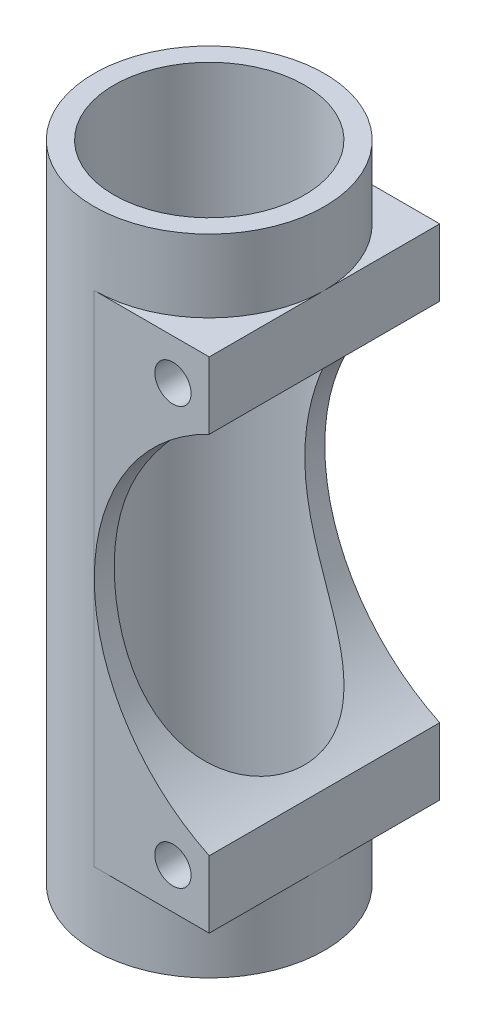
ISO-10303-21;
HEADER;
FILE_DESCRIPTION(('STEP AP214'),'2;1');
FILE_NAME('part.step','',(''),(''),'','','');
FILE_SCHEMA(('AUTOMOTIVE_DESIGN { 1 0 10303 214 1 1 1 1 }'));
ENDSEC;
DATA;
#1=APPLICATION_CONTEXT('core data for automotive mechanical design processes');
#2=APPLICATION_PROTOCOL_DEFINITION('international standard','automotive_design',2000,#1);
#3=PRODUCT_CONTEXT('',#1,'mechanical');
#4=PRODUCT('Part','Part','',(#3));
#5=PRODUCT_RELATED_PRODUCT_CATEGORY('part','',(#4));
#6=PRODUCT_DEFINITION_FORMATION('','',#4);
#7=PRODUCT_DEFINITION_CONTEXT('part definition',#1,'design');
#8=PRODUCT_DEFINITION('design','',#6,#7);
#9=PRODUCT_DEFINITION_SHAPE('','',#8);
#10=(LENGTH_UNIT() NAMED_UNIT(*) SI_UNIT(.MILLI.,.METRE.));
#11=(NAMED_UNIT(*) PLANE_ANGLE_UNIT() SI_UNIT($,.RADIAN.));
#12=(NAMED_UNIT(*) SI_UNIT($,.STERADIAN.) SOLID_ANGLE_UNIT());
#13=UNCERTAINTY_MEASURE_WITH_UNIT(LENGTH_MEASURE(1.E-05),#10,'distance_accuracy_value','');
#14=(GEOMETRIC_REPRESENTATION_CONTEXT(3) GLOBAL_UNCERTAINTY_ASSIGNED_CONTEXT((#13)) GLOBAL_UNIT_ASSIGNED_CONTEXT((#10,
#11,#12)) REPRESENTATION_CONTEXT('',''));
#15=CARTESIAN_POINT('',(0.,0.,0.));
#16=DIRECTION('',(0.,0.,1.));
#17=DIRECTION('',(1.,0.,0.));
#18=AXIS2_PLACEMENT_3D('',#15,#16,#17);
#19=CARTESIAN_POINT('',(12.7,63.,0.));
#20=DIRECTION('',(-1.,0.,0.));
#21=DIRECTION('',(0.,0.,1.));
#22=AXIS2_PLACEMENT_3D('',#19,#20,#21);
#23=PLANE('',#22);
#24=DIRECTION('',(0.,0.,-1.));
#25=VECTOR('',#24,1.);
#26=CARTESIAN_POINT('',(12.7,55.6104230423969,15.));
#27=LINE('',#26,#25);
#28=CARTESIAN_POINT('',(12.7,55.6104230423969,-12.7));
#29=VERTEX_POINT('',#28);
#30=CARTESIAN_POINT('',(12.7,55.6104230423969,12.7));
#31=VERTEX_POINT('',#30);
#32=EDGE_CURVE('E56',#29,#31,#27,.F.);
#33=ORIENTED_EDGE('',*,*,#32,.F.);
#34=DIRECTION('',(0.,-1.,0.));
#35=VECTOR('',#34,1.);
#36=CARTESIAN_POINT('',(12.7,63.,-12.7));
#37=LINE('',#36,#35);
#38=CARTESIAN_POINT('',(12.7,63.,-12.7));
#39=VERTEX_POINT('',#38);
#40=EDGE_CURVE('E212',#39,#29,#37,.T.);
#41=ORIENTED_EDGE('',*,*,#40,.F.);
#42=DIRECTION('',(0.,0.,-1.));
#43=VECTOR('',#42,1.);
#44=CARTESIAN_POINT('',(12.7,63.,0.));
#45=LINE('',#44,#43);
#46=CARTESIAN_POINT('',(12.7,63.,0.));
#47=VERTEX_POINT('',#46);
#48=EDGE_CURVE('E222',#47,#39,#45,.T.);
#49=ORIENTED_EDGE('',*,*,#48,.F.);
#50=DIRECTION('',(0.,0.,-1.));
#51=VECTOR('',#50,1.);
#52=CARTESIAN_POINT('',(12.7,63.,0.));
#53=LINE('',#52,#51);
#54=CARTESIAN_POINT('',(12.7,63.,12.7));
#55=VERTEX_POINT('',#54);
#56=EDGE_CURVE('E224',#55,#47,#53,.T.);
#57=ORIENTED_EDGE('',*,*,#56,.F.);
#58=DIRECTION('',(0.,-1.,0.));
#59=VECTOR('',#58,1.);
#60=CARTESIAN_POINT('',(12.7,63.,12.7));
#61=LINE('',#60,#59);
#62=EDGE_CURVE('E122',#55,#31,#61,.T.);
#63=ORIENTED_EDGE('',*,*,#62,.T.);
#64=EDGE_LOOP('',(#33,#41,#49,#57,#63));
#65=FACE_BOUND('',#64,.T.);
#66=ADVANCED_FACE('F35',(#65),#23,.F.);
#67=DIRECTION('',(0.,0.,-1.));
#68=VECTOR('',#67,1.);
#69=CARTESIAN_POINT('',(12.7,15.3895769576031,15.));
#70=LINE('',#69,#68);
#71=CARTESIAN_POINT('',(12.7,15.3895769576031,12.7));
#72=VERTEX_POINT('',#71);
#73=CARTESIAN_POINT('',(12.7,15.3895769576031,-12.7));
#74=VERTEX_POINT('',#73);
#75=EDGE_CURVE('E101',#72,#74,#70,.T.);
#76=ORIENTED_EDGE('',*,*,#75,.F.);
#77=CARTESIAN_POINT('',(12.7,8.,12.7));
#78=VERTEX_POINT('',#77);
#79=EDGE_CURVE('E112',#72,#78,#61,.T.);
#80=ORIENTED_EDGE('',*,*,#79,.T.);
#81=DIRECTION('',(0.,0.,1.));
#82=VECTOR('',#81,1.);
#83=CARTESIAN_POINT('',(12.7,8.,0.));
#84=LINE('',#83,#82);
#85=CARTESIAN_POINT('',(12.7,8.,0.));
#86=VERTEX_POINT('',#85);
#87=EDGE_CURVE('E209',#86,#78,#84,.T.);
#88=ORIENTED_EDGE('',*,*,#87,.F.);
#89=DIRECTION('',(0.,0.,1.));
#90=VECTOR('',#89,1.);
#91=CARTESIAN_POINT('',(12.7,8.,0.));
#92=LINE('',#91,#90);
#93=CARTESIAN_POINT('',(12.7,8.,-12.7));
#94=VERTEX_POINT('',#93);
#95=EDGE_CURVE('E205',#94,#86,#92,.T.);
#96=ORIENTED_EDGE('',*,*,#95,.F.);
#97=EDGE_CURVE('E115',#74,#94,#37,.T.);
#98=ORIENTED_EDGE('',*,*,#97,.F.);
#99=EDGE_LOOP('',(#76,#80,#88,#96,#98));
#100=FACE_BOUND('',#99,.T.);
#101=ADVANCED_FACE('F110',(#100),#23,.F.);
#102=CARTESIAN_POINT('',(0.,71.,0.));
#103=DIRECTION('',(0.,-1.,0.));
#104=DIRECTION('',(0.,0.,-1.));
#105=AXIS2_PLACEMENT_3D('',#102,#103,#104);
#106=CYLINDRICAL_SURFACE('',#105,10.5);
#107=CARTESIAN_POINT('',(0.,0.,0.));
#108=DIRECTION('',(0.,1.,0.));
#109=DIRECTION('',(0.,0.,1.));
#110=AXIS2_PLACEMENT_3D('',#107,#108,#109);
#111=CIRCLE('',#110,10.5);
#112=CARTESIAN_POINT('',(0.,0.,10.5));
#113=VERTEX_POINT('',#112);
#114=EDGE_CURVE('E134',#113,#113,#111,.T.);
#115=ORIENTED_EDGE('',*,*,#114,.F.);
#116=EDGE_LOOP('',(#115));
#117=FACE_BOUND('',#116,.T.);
#118=CARTESIAN_POINT('',(0.,71.,0.));
#119=DIRECTION('',(0.,1.,0.));
#120=DIRECTION('',(0.,0.,1.));
#121=AXIS2_PLACEMENT_3D('',#118,#119,#120);
#122=CIRCLE('',#121,10.5);
#123=CARTESIAN_POINT('',(0.,71.,10.5));
#124=VERTEX_POINT('',#123);
#125=EDGE_CURVE('E131',#124,#124,#122,.T.);
#126=ORIENTED_EDGE('',*,*,#125,.T.);
#127=EDGE_LOOP('',(#126));
#128=FACE_BOUND('',#127,.T.);
#129=CARTESIAN_POINT('',(0.0334549910854104,35.5,10.4999467028919));
#130=CARTESIAN_POINT('',(0.0334532838015858,35.1873498070494,10.4999412191237));
#131=CARTESIAN_POINT('',(0.0400304847042457,34.8747329443358,10.4999304589833));
#132=CARTESIAN_POINT('',(0.066323780495252,34.2500293337308,10.4998002243213));
#133=CARTESIAN_POINT('',(0.0860400887395591,33.9379425945302,10.4996807480342));
#134=CARTESIAN_POINT('',(0.138580935299864,33.3148555102572,10.499117917577));
#135=CARTESIAN_POINT('',(0.171406470584911,33.0038552496275,10.4986745387716));
#136=CARTESIAN_POINT('',(0.250111352875709,32.3834754081164,10.4970946237287));
#137=CARTESIAN_POINT('',(0.295992176223111,32.0740960145607,10.4959580090809));
#138=CARTESIAN_POINT('',(0.400750665115911,31.457390725088,10.4924804610164));
#139=CARTESIAN_POINT('',(0.459634887612319,31.1500659460453,10.4901389192211));
#140=CARTESIAN_POINT('',(0.590270584807654,30.5382207951896,10.4835993860834));
#141=CARTESIAN_POINT('',(0.662020544175722,30.2337000975469,10.4794016132833));
#142=CARTESIAN_POINT('',(0.818247177100978,29.6280274181659,10.4683621694474));
#143=CARTESIAN_POINT('',(0.90272209932753,29.3268749789733,10.4615208620376));
#144=CARTESIAN_POINT('',(1.08422230535112,28.7285073183845,10.4442690521053));
#145=CARTESIAN_POINT('',(1.181247002069,28.43129191353,10.4338587165046));
#146=CARTESIAN_POINT('',(1.44789816448664,27.6691686645804,10.4010003129192));
#147=CARTESIAN_POINT('',(1.6268495600335,27.2076234545727,10.3750726694734));
#148=CARTESIAN_POINT('',(2.01457710464675,26.2984546032389,10.3068037408248));
#149=CARTESIAN_POINT('',(2.22335330940053,25.8508309879084,10.264462424975));
#150=CARTESIAN_POINT('',(2.66859573831134,24.973224666901,10.1578007857593));
#151=CARTESIAN_POINT('',(2.90501132465722,24.5432115906374,10.0935202546543));
#152=CARTESIAN_POINT('',(3.40317067979025,23.7035162835784,9.93662801997184));
#153=CARTESIAN_POINT('',(3.66490457253901,23.2938262188728,9.84402733315377));
#154=CARTESIAN_POINT('',(4.12894367428616,22.6165849405995,9.6563201650979));
#155=CARTESIAN_POINT('',(4.32588547830423,22.3428793928227,9.5700820319011));
#156=CARTESIAN_POINT('',(4.72834625986039,21.8091104111034,9.37776448571488));
#157=CARTESIAN_POINT('',(4.93386299394671,21.5490434485996,9.27169023745603));
#158=CARTESIAN_POINT('',(5.35081584615413,21.0444515350184,9.03747089111402));
#159=CARTESIAN_POINT('',(5.56224597843707,20.7999116323489,8.9093474801578));
#160=CARTESIAN_POINT('',(5.98809592016627,20.3278807683158,8.62888510082983));
#161=CARTESIAN_POINT('',(6.20251519274744,20.1003867910375,8.47655043108322));
#162=CARTESIAN_POINT('',(6.59303409528827,19.7024373473319,8.17506103111648));
#163=CARTESIAN_POINT('',(6.76926013541841,19.5289751116921,8.03003270414369));
#164=CARTESIAN_POINT('',(7.11876576337152,19.1957252770633,7.72187945457256));
#165=CARTESIAN_POINT('',(7.29204595503237,19.0359348478824,7.55875829349388));
#166=CARTESIAN_POINT('',(7.63305888898937,18.7307942733277,7.21423210780559));
#167=CARTESIAN_POINT('',(7.80079208696623,18.5854429398192,7.03282859005589));
#168=CARTESIAN_POINT('',(8.12798493504064,18.3097791123213,6.65198279285011));
#169=CARTESIAN_POINT('',(8.28744446110267,18.1794668437556,6.45254024308309));
#170=CARTESIAN_POINT('',(8.59616440783506,17.9336346537273,6.03520388738829));
#171=CARTESIAN_POINT('',(8.74536411291063,17.8181997563493,5.81721490909189));
#172=CARTESIAN_POINT('',(9.02988429204928,17.6031836493838,5.36493802056833));
#173=CARTESIAN_POINT('',(9.165204459688,17.5036027897858,5.13064975068645));
#174=CARTESIAN_POINT('',(9.41944495304614,17.3203310187621,4.64742808731445));
#175=CARTESIAN_POINT('',(9.5383663529559,17.2366390664087,4.3984956546058));
#176=CARTESIAN_POINT('',(9.75760498375693,17.0850144126462,3.88796862009996));
#177=CARTESIAN_POINT('',(9.85792387223081,17.0170803069937,3.62637514909041));
#178=CARTESIAN_POINT('',(10.0293573254992,16.9025963632934,3.11875572701642));
#179=CARTESIAN_POINT('',(10.1023631032926,16.8546095103505,2.87368937833849));
#180=CARTESIAN_POINT('',(10.2306492665447,16.7710991335061,2.37689230084512));
#181=CARTESIAN_POINT('',(10.2859308806422,16.7355747456908,2.12516203528239));
#182=CARTESIAN_POINT('',(10.3779604175509,16.676816642188,1.6169759126805));
#183=CARTESIAN_POINT('',(10.4147118563921,16.653580594794,1.36052096171202));
#184=CARTESIAN_POINT('',(10.4691720233172,16.6192554314381,0.844789469693714));
#185=CARTESIAN_POINT('',(10.4868808678369,16.6081662412043,0.585512945906178));
#186=CARTESIAN_POINT('',(10.5027361054589,16.5982354965282,0.0748312841123741));
#187=CARTESIAN_POINT('',(10.501517688845,16.5989962652336,-0.176546715945235));
#188=CARTESIAN_POINT('',(10.4810769692892,16.6118049523751,-0.678275729176621));
#189=CARTESIAN_POINT('',(10.4618552072258,16.6238525317193,-0.928626772976522));
#190=CARTESIAN_POINT('',(10.4056659818481,16.6593014503233,-1.42648669015901));
#191=CARTESIAN_POINT('',(10.3687005874124,16.6827014659112,-1.67399589145163));
#192=CARTESIAN_POINT('',(10.277519002864,16.7409785928792,-2.16444345678371));
#193=CARTESIAN_POINT('',(10.2233027393115,16.7758557531195,-2.40738180135959));
#194=CARTESIAN_POINT('',(10.0985125202604,16.8571442076073,-2.8863715880607));
#195=CARTESIAN_POINT('',(10.0279802652276,16.9035261194492,-3.12243888829953));
#196=CARTESIAN_POINT('',(9.87145030236364,17.0080373734036,-3.58670882848431));
#197=CARTESIAN_POINT('',(9.78545273783286,17.066166606667,-3.81491154127963));
#198=CARTESIAN_POINT('',(9.59919595210787,17.1943166425821,-4.2619316024329));
#199=CARTESIAN_POINT('',(9.49893819311239,17.2643362261746,-4.48074991005007));
#200=CARTESIAN_POINT('',(9.28556014640257,17.4163708726711,-4.90768031724999));
#201=CARTESIAN_POINT('',(9.17243971349795,17.4983860709813,-5.11579229594417));
#202=CARTESIAN_POINT('',(8.93290462919394,17.6759295038578,-5.52359312418266));
#203=CARTESIAN_POINT('',(8.80629664852225,17.7716637796272,-5.72307860440436));
#204=CARTESIAN_POINT('',(8.54324307156812,17.9754701890568,-6.10880507916691));
#205=CARTESIAN_POINT('',(8.40679744035674,18.083542366524,-6.29504602667791));
#206=CARTESIAN_POINT('',(8.12598003775397,18.3118152269952,-6.65359362618394));
#207=CARTESIAN_POINT('',(7.98160795690152,18.4320163836873,-6.82589973349049));
#208=CARTESIAN_POINT('',(7.6868787421882,18.6842120978674,-7.15617895913933));
#209=CARTESIAN_POINT('',(7.53652094134761,18.8162079716738,-7.31415047373186));
#210=CARTESIAN_POINT('',(7.22118172431152,19.1010729476438,-7.62607819629806));
#211=CARTESIAN_POINT('',(7.05590905314001,19.2547546845719,-7.77899719629309));
#212=CARTESIAN_POINT('',(6.72296015188509,19.5743796575865,-8.06848725503758));
#213=CARTESIAN_POINT('',(6.55528386669617,19.7403231751516,-8.20505793831037));
#214=CARTESIAN_POINT('',(6.21953025828227,20.0837408035154,-8.4623990986153));
#215=CARTESIAN_POINT('',(6.05145284179263,20.2612179130789,-8.58316544167994));
#216=CARTESIAN_POINT('',(5.71674562965881,20.6268463486376,-8.80963492938912));
#217=CARTESIAN_POINT('',(5.55011612998119,20.8149998004121,-8.91533505936354));
#218=CARTESIAN_POINT('',(5.13514471326988,21.3002625495795,-9.16324202969921));
#219=CARTESIAN_POINT('',(4.88875495084101,21.6037322257429,-9.29634457671393));
#220=CARTESIAN_POINT('',(4.40743308870188,22.2303269931879,-9.53397374411841));
#221=CARTESIAN_POINT('',(4.17250582710901,22.5534602569977,-9.63848838233754));
#222=CARTESIAN_POINT('',(3.71696615088132,23.2174073801943,-9.8231721903499));
#223=CARTESIAN_POINT('',(3.49638731936657,23.5582595806767,-9.90328575448152));
#224=CARTESIAN_POINT('',(3.07255543273648,24.254547130045,-10.0428665341322));
#225=CARTESIAN_POINT('',(2.8693025621472,24.6099826341873,-10.1023335297806));
#226=CARTESIAN_POINT('',(2.40784616626902,25.4715121882989,-10.2239458124626));
#227=CARTESIAN_POINT('',(2.15827851603747,25.9833303161181,-10.2784503739582));
#228=CARTESIAN_POINT('',(1.69845686253893,27.0262477040247,-10.3643593250636));
#229=CARTESIAN_POINT('',(1.48821753887911,27.5573540756244,-10.395755101919));
#230=CARTESIAN_POINT('',(1.10889929160603,28.6348925345374,-10.4430304723919));
#231=CARTESIAN_POINT('',(0.939833965820634,29.1813296185989,-10.4589049452593));
#232=CARTESIAN_POINT('',(0.644178264358825,30.2856671198503,-10.4812694871218));
#233=CARTESIAN_POINT('',(0.517583496879344,30.8435663454254,-10.4877605266705));
#234=CARTESIAN_POINT('',(0.305415365628885,31.9793469398847,-10.4961065807705));
#235=CARTESIAN_POINT('',(0.220764987267538,32.5574014670036,-10.49786077174));
#236=CARTESIAN_POINT('',(0.0970804005859797,33.7183849337183,-10.4997337171234));
#237=CARTESIAN_POINT('',(0.0580471987405413,34.3013139805774,-10.4998524354536));
#238=CARTESIAN_POINT('',(0.0258318900700132,35.4685630472047,-10.4999800470454));
#239=CARTESIAN_POINT('',(0.03266090838906,36.0528833700996,-10.4999889136581));
#240=CARTESIAN_POINT('',(0.0921695408085583,37.2192578345058,-10.4996400679739));
#241=CARTESIAN_POINT('',(0.144849815895211,37.8013119432262,-10.4992823503924));
#242=CARTESIAN_POINT('',(0.260785894182434,38.6913535663228,-10.4968335445191));
#243=CARTESIAN_POINT('',(0.307869314625543,39.0015358667828,-10.4956210953568));
#244=CARTESIAN_POINT('',(0.415076593269348,39.6196236594331,-10.4919311489897));
#245=CARTESIAN_POINT('',(0.475199346119684,39.9275293423268,-10.4894537589905));
#246=CARTESIAN_POINT('',(0.608396652160263,40.5406026228009,-10.4825709336796));
#247=CARTESIAN_POINT('',(0.681475274032285,40.8457693285063,-10.4781648920506));
#248=CARTESIAN_POINT('',(0.840422423215824,41.4526695519797,-10.4666155412439));
#249=CARTESIAN_POINT('',(0.926289558289999,41.7544034396217,-10.4594725298967));
#250=CARTESIAN_POINT('',(1.11059686373569,42.3537324911854,-10.4415105500119));
#251=CARTESIAN_POINT('',(1.20903066055416,42.6513296689011,-10.4306934403154));
#252=CARTESIAN_POINT('',(1.41827079891917,43.2418935443719,-10.4043080485618));
#253=CARTESIAN_POINT('',(1.52907566345185,43.534860790149,-10.388740333308));
#254=CARTESIAN_POINT('',(1.76274698199949,44.1154516530069,-10.3516527119485));
#255=CARTESIAN_POINT('',(1.88560913193557,44.4030771336447,-10.3301349248851));
#256=CARTESIAN_POINT('',(2.14304585001128,44.9723495419089,-10.279812649974));
#257=CARTESIAN_POINT('',(2.27761916180308,45.2539971068107,-10.2510089431132));
#258=CARTESIAN_POINT('',(2.60214808342186,45.8981539980666,-10.1742191483676));
#259=CARTESIAN_POINT('',(2.79621091656389,46.2582370783645,-10.1230491897023));
#260=CARTESIAN_POINT('',(3.20231891390129,46.9647822631699,-10.002000869936));
#261=CARTESIAN_POINT('',(3.41435921384547,47.3112480152862,-9.93212755852473));
#262=CARTESIAN_POINT('',(3.85405402744822,47.9878700552137,-9.76990708558562));
#263=CARTESIAN_POINT('',(4.08168128772718,48.3180531571242,-9.67759846558533));
#264=CARTESIAN_POINT('',(4.55001295946686,48.9601804538429,-9.46643074685749));
#265=CARTESIAN_POINT('',(4.79071411357663,49.2721291518903,-9.34757823876452));
#266=CARTESIAN_POINT('',(5.22521048175192,49.8060975192893,-9.11008541815966));
#267=CARTESIAN_POINT('',(5.41715113814696,50.0323742432752,-8.99760647659784));
#268=CARTESIAN_POINT('',(5.80420872654657,50.4710836734365,-8.752916975293));
#269=CARTESIAN_POINT('',(5.99932482306528,50.6835199498447,-8.62071153331192));
#270=CARTESIAN_POINT('',(6.39006348581048,51.0932546478665,-8.33520358009782));
#271=CARTESIAN_POINT('',(6.58568603258333,51.2905536422668,-8.18190186775007));
#272=CARTESIAN_POINT('',(6.97431809498648,51.6687650776879,-7.85325600699461));
#273=CARTESIAN_POINT('',(7.16732758365465,51.8496773497363,-7.67791163133748));
#274=CARTESIAN_POINT('',(7.54901375473165,52.1956037509768,-7.30305306857659));
#275=CARTESIAN_POINT('',(7.73763350978376,52.3604545289892,-7.10332942913143));
#276=CARTESIAN_POINT('',(8.10485020182736,52.6714334232292,-6.68128916736555));
#277=CARTESIAN_POINT('',(8.28344684630497,52.8175609931992,-6.45897188620491));
#278=CARTESIAN_POINT('',(8.62665786670672,53.0904184308616,-5.99286968933409));
#279=CARTESIAN_POINT('',(8.79127926899439,53.2171580722808,-5.74909568855167));
#280=CARTESIAN_POINT('',(9.10291509731808,53.4510356179364,-5.24170992336792));
#281=CARTESIAN_POINT('',(9.24993256233341,53.5581769071391,-4.97810159581106));
#282=CARTESIAN_POINT('',(9.50275282657521,53.7384363565774,-4.4738195886984));
#283=CARTESIAN_POINT('',(9.6114344762756,53.8142437489694,-4.23554094922914));
#284=CARTESIAN_POINT('',(9.81180923569083,53.9517975171639,-3.74804243862736));
#285=CARTESIAN_POINT('',(9.90350414771204,54.0135453848527,-3.49882373171939));
#286=CARTESIAN_POINT('',(10.0683877280121,54.1231693693235,-2.99144089335724));
#287=CARTESIAN_POINT('',(10.1415804858482,54.1710485518624,-2.73327875305197));
#288=CARTESIAN_POINT('',(10.2683066516484,54.253173190285,-2.21005079647143));
#289=CARTESIAN_POINT('',(10.3218406048271,54.2874190242764,-1.94498517187479));
#290=CARTESIAN_POINT('',(10.4053935713746,54.3405571242782,-1.42875387276544));
#291=CARTESIAN_POINT('',(10.4367880380228,54.360350880808,-1.17790212438372));
#292=CARTESIAN_POINT('',(10.481400674247,54.3884127950895,-0.673956671214395));
#293=CARTESIAN_POINT('',(10.4946199025923,54.3966816242076,-0.420863097885181));
#294=CARTESIAN_POINT('',(10.502705080375,54.4017435992588,0.0856861884853747));
#295=CARTESIAN_POINT('',(10.4975742107734,54.3985387341389,0.33914183114876));
#296=CARTESIAN_POINT('',(10.4690353362903,54.3806386156061,0.844616632794512));
#297=CARTESIAN_POINT('',(10.445627225804,54.3659432958022,1.09663578346845));
#298=CARTESIAN_POINT('',(10.3812320753894,54.3252192366925,1.59444958328446));
#299=CARTESIAN_POINT('',(10.3404554151143,54.2993260775285,1.8402825855742));
#300=CARTESIAN_POINT('',(10.2419062436946,54.2361038300817,2.32701732516662));
#301=CARTESIAN_POINT('',(10.1841339986159,54.1987749208251,2.56791913960391));
#302=CARTESIAN_POINT('',(10.0523805368073,54.112522037863,3.04309498069955));
#303=CARTESIAN_POINT('',(9.97840092571574,54.0635992127092,3.27736966130353));
#304=CARTESIAN_POINT('',(9.81524428362003,53.9539887408036,3.73772900706519));
#305=CARTESIAN_POINT('',(9.72606716024842,53.8933010225467,3.96381362243514));
#306=CARTESIAN_POINT('',(9.53313147469995,53.759586575173,4.40776152099044));
#307=CARTESIAN_POINT('',(9.42928209204445,53.686482371019,4.62556197231269));
#308=CARTESIAN_POINT('',(9.20892030936684,53.5281276305411,5.050047116738));
#309=CARTESIAN_POINT('',(9.09240796514956,53.4428771477445,5.25673185882126));
#310=CARTESIAN_POINT('',(8.8483782959983,53.2602351940507,5.65785417692575));
#311=CARTESIAN_POINT('',(8.72086141056764,53.1628442079563,5.85229224152316));
#312=CARTESIAN_POINT('',(8.45660456879553,52.9560297807266,6.22804974570892));
#313=CARTESIAN_POINT('',(8.31986435612697,52.8466060051325,6.40936882041461));
#314=CARTESIAN_POINT('',(8.03340131161858,52.6113381152793,6.76525764040576));
#315=CARTESIAN_POINT('',(7.88337787234407,52.4850119383416,6.93926639403849));
#316=CARTESIAN_POINT('',(7.57749669864499,52.2200010923056,7.27204450616733));
#317=CARTESIAN_POINT('',(7.42163895205111,52.081316397429,7.43081383287426));
#318=CARTESIAN_POINT('',(7.10612017149375,51.7920840171982,7.73309776181561));
#319=CARTESIAN_POINT('',(6.94645836405998,51.6415339046659,7.87660922874046));
#320=CARTESIAN_POINT('',(6.62529438728928,51.3292142123563,8.14860612925635));
#321=CARTESIAN_POINT('',(6.46379185718523,51.1674424004787,8.277088559701));
#322=CARTESIAN_POINT('',(6.07694631361831,50.7673971410088,8.56738334583404));
#323=CARTESIAN_POINT('',(5.85157478912549,50.5241379861677,8.72232519502401));
#324=CARTESIAN_POINT('',(5.4049850818639,50.0191698516533,9.00589693684279));
#325=CARTESIAN_POINT('',(5.18376826103788,49.7574549512547,9.13451833358776));
#326=CARTESIAN_POINT('',(4.74857675646227,49.2171860196302,9.36814424960949));
#327=CARTESIAN_POINT('',(4.53461533209836,48.9386035039244,9.47310732121479));
#328=CARTESIAN_POINT('',(4.11704450841503,48.3669835623188,9.66190723337538));
#329=CARTESIAN_POINT('',(3.91343551135529,48.0739455755995,9.74574325350623));
#330=CARTESIAN_POINT('',(3.44031803886565,47.3564114686263,9.92477698169755));
#331=CARTESIAN_POINT('',(3.1766867634444,46.9258576789547,10.0113015600645));
#332=CARTESIAN_POINT('',(2.6775382413884,46.0441902466389,10.1561982773547));
#333=CARTESIAN_POINT('',(2.4420322689284,45.5930684586613,10.2145591550264));
#334=CARTESIAN_POINT('',(2.00146727933326,44.6734197168069,10.3099459993598));
#335=CARTESIAN_POINT('',(1.79644482367022,44.2048726916729,10.3469464975366));
#336=CARTESIAN_POINT('',(1.41885916520122,43.2540401215193,10.4054466238734));
#337=CARTESIAN_POINT('',(1.2462941419079,42.7717553487769,10.4269471215961));
#338=CARTESIAN_POINT('',(0.915788820618061,41.7369282636586,10.4614653090325));
#339=CARTESIAN_POINT('',(0.76216317192268,41.1829612261821,10.4731372940333));
#340=CARTESIAN_POINT('',(0.498127326915477,40.064700140606,10.4890111614182));
#341=CARTESIAN_POINT('',(0.38772092766968,39.5004051896952,10.4932123875668));
#342=CARTESIAN_POINT('',(0.210840531916164,38.3651492305948,10.4982555025507));
#343=CARTESIAN_POINT('',(0.144353256607916,37.7941902904205,10.4990984071514));
#344=CARTESIAN_POINT('',(0.0556620163256843,36.6487834128098,10.4999490448542));
#345=CARTESIAN_POINT('',(0.0334581273497686,36.0743354693874,10.4999567765228));
#346=CARTESIAN_POINT('',(0.0334549910854104,35.5,10.4999467028919));
#347=B_SPLINE_CURVE_WITH_KNOTS('',3,(#129,#130,#131,#132,#133,#134,#135,#136,#137,#138,#139,
#140,#141,#142,#143,#144,#145,#146,#147,#148,#149,#150,#151,#152,#153,#154,#155,#156,#157,#158,
#159,#160,#161,#162,#163,#164,#165,#166,#167,#168,#169,#170,#171,#172,#173,#174,#175,#176,#177,
#178,#179,#180,#181,#182,#183,#184,#185,#186,#187,#188,#189,#190,#191,#192,#193,#194,#195,#196,
#197,#198,#199,#200,#201,#202,#203,#204,#205,#206,#207,#208,#209,#210,#211,#212,#213,#214,#215,
#216,#217,#218,#219,#220,#221,#222,#223,#224,#225,#226,#227,#228,#229,#230,#231,#232,#233,#234,
#235,#236,#237,#238,#239,#240,#241,#242,#243,#244,#245,#246,#247,#248,#249,#250,#251,#252,#253,
#254,#255,#256,#257,#258,#259,#260,#261,#262,#263,#264,#265,#266,#267,#268,#269,#270,#271,#272,
#273,#274,#275,#276,#277,#278,#279,#280,#281,#282,#283,#284,#285,#286,#287,#288,#289,#290,#291,
#292,#293,#294,#295,#296,#297,#298,#299,#300,#301,#302,#303,#304,#305,#306,#307,#308,#309,#310,
#311,#312,#313,#314,#315,#316,#317,#318,#319,#320,#321,#322,#323,#324,#325,#326,#327,#328,#329,
#330,#331,#332,#333,#334,#335,#336,#337,#338,#339,#340,#341,#342,#343,#344,#345,#346),
.UNSPECIFIED.,.T.,.F.,(4,2,2,2,2,2,2,2,2,2,2,2,2,2,2,2,2,2,2,2,2,2,2,2,2,2,2,2,2,2,2,2,2,2,2,2,
2,2,2,2,2,2,2,2,2,2,2,2,2,2,2,2,2,2,2,2,2,2,2,2,2,2,2,2,2,2,2,2,2,2,2,2,2,2,2,2,2,2,2,2,2,2,2,2,
2,2,2,2,2,2,2,2,2,2,2,2,2,2,2,2,2,2,2,2,2,2,2,2,4),(0.,0.937823724375461,1.87566267772746,
2.81357296820059,3.75158936331786,4.69007983672076,5.62845984691447,6.56671082610852,
7.50491792973154,8.9906608981375,10.4764066406844,11.9594718068817,13.4419607815218,
14.4852883938243,15.5283447321261,16.5703809436553,17.6122323515159,18.4713935240678,
19.3303764097133,20.1892885544814,21.048213571993,21.911848076965,22.775501644655,
23.6390986123936,24.5026185920383,25.2821733081625,26.0616739738836,26.8410266766228,
27.6203746139876,28.3736261893417,29.1268551353203,29.879996277362,30.6331406256961,
31.3843809464987,32.1356143067214,32.8867706931237,33.6379355592118,34.4018717675003,
35.1658106883051,35.9297794557256,36.6938335906208,37.5108452461826,38.3278756626956,
39.1451193658609,39.9625263663278,41.1994362427367,42.4368637587482,43.677090407989,
44.9173302643222,46.6309404070952,48.3451888976117,50.0600027580979,51.7746392381091,
53.5254942101555,55.2763878114689,57.027706155568,58.7790497468798,59.7200260577033,
60.6609226326776,61.6021152134179,62.5432054048583,63.4838201768607,64.4243227662757,
65.3644908381173,66.3045581748249,67.5402712118924,68.7756509566068,70.0089232643643,
71.2418897002556,72.1930253119799,73.1439145926712,74.0947678744646,75.0456309599101,
76.0053297338128,76.9650565009618,77.9242978506122,78.8833733663251,79.7002398667672,
80.5170196473227,81.3336187357279,82.1501951749799,82.9100323866659,83.6698253333911,
84.4294865775757,85.1891522110643,85.9398668230962,86.6905696833143,87.4411982061833,
88.1918312913877,88.9473328031437,89.7028309855902,90.4582990086309,91.2137880356749,
91.9995288847257,92.7852713727818,93.5711750108148,94.3572354231261,95.4536669268025,
96.5504517873252,97.6491434533112,98.7478777780962,100.282220186371,101.817175593941,
103.35395740515,104.890652994915,106.613793332199,108.337085023568,110.059855444674,
111.782628822354),.UNSPECIFIED.);
#348=CARTESIAN_POINT('',(0.0334549910854104,35.5,10.4999467028919));
#349=VERTEX_POINT('',#348);
#350=EDGE_CURVE('E39',#349,#349,#347,.T.);
#351=ORIENTED_EDGE('',*,*,#350,.T.);
#352=EDGE_LOOP('',(#351));
#353=FACE_BOUND('',#352,.T.);
#354=ADVANCED_FACE('F144',(#117,#128,#353),#106,.F.);
#355=CARTESIAN_POINT('',(0.,0.,0.));
#356=DIRECTION('',(0.,1.,0.));
#357=DIRECTION('',(0.,0.,1.));
#358=AXIS2_PLACEMENT_3D('',#355,#356,#357);
#359=PLANE('',#358);
#360=ORIENTED_EDGE('',*,*,#114,.T.);
#361=EDGE_LOOP('',(#360));
#362=FACE_BOUND('',#361,.T.);
#363=CARTESIAN_POINT('',(0.,0.,0.));
#364=DIRECTION('',(0.,1.,0.));
#365=DIRECTION('',(0.,0.,1.));
#366=AXIS2_PLACEMENT_3D('',#363,#364,#365);
#367=CIRCLE('',#366,12.7);
#368=CARTESIAN_POINT('',(0.,0.,12.7));
#369=VERTEX_POINT('',#368);
#370=EDGE_CURVE('E48',#369,#369,#367,.T.);
#371=ORIENTED_EDGE('',*,*,#370,.F.);
#372=EDGE_LOOP('',(#371));
#373=FACE_BOUND('',#372,.T.);
#374=ADVANCED_FACE('F141',(#362,#373),#359,.F.);
#375=CARTESIAN_POINT('',(0.,63.,-12.7));
#376=DIRECTION('',(0.,0.,1.));
#377=DIRECTION('',(1.,0.,0.));
#378=AXIS2_PLACEMENT_3D('',#375,#376,#377);
#379=PLANE('',#378);
#380=CARTESIAN_POINT('',(8.7,58.5,-12.7));
#381=DIRECTION('',(0.,0.,-1.));
#382=DIRECTION('',(-1.,0.,0.));
#383=AXIS2_PLACEMENT_3D('',#380,#381,#382);
#384=CIRCLE('',#383,2.);
#385=CARTESIAN_POINT('',(6.7,58.5,-12.7));
#386=VERTEX_POINT('',#385);
#387=EDGE_CURVE('E182',#386,#386,#384,.T.);
#388=ORIENTED_EDGE('',*,*,#387,.F.);
#389=EDGE_LOOP('',(#388));
#390=FACE_BOUND('',#389,.T.);
#391=CARTESIAN_POINT('',(8.7,12.5,-12.7));
#392=DIRECTION('',(0.,0.,-1.));
#393=DIRECTION('',(-1.,0.,0.));
#394=AXIS2_PLACEMENT_3D('',#391,#392,#393);
#395=CIRCLE('',#394,2.);
#396=CARTESIAN_POINT('',(6.7,12.5,-12.7));
#397=VERTEX_POINT('',#396);
#398=EDGE_CURVE('E195',#397,#397,#395,.T.);
#399=ORIENTED_EDGE('',*,*,#398,.F.);
#400=EDGE_LOOP('',(#399));
#401=FACE_BOUND('',#400,.T.);
#402=CARTESIAN_POINT('',(22.3311879960002,35.5,-12.7));
#403=DIRECTION('',(0.,0.,1.));
#404=DIRECTION('',(1.,0.,0.));
#405=AXIS2_PLACEMENT_3D('',#402,#403,#404);
#406=CIRCLE('',#405,22.2977330049148);
#407=EDGE_CURVE('E200',#74,#29,#406,.F.);
#408=ORIENTED_EDGE('',*,*,#407,.F.);
#409=ORIENTED_EDGE('',*,*,#97,.T.);
#410=DIRECTION('',(1.,0.,0.));
#411=VECTOR('',#410,1.);
#412=CARTESIAN_POINT('',(0.,8.,-12.7));
#413=LINE('',#412,#411);
#414=CARTESIAN_POINT('',(0.,8.,-12.7));
#415=VERTEX_POINT('',#414);
#416=EDGE_CURVE('E203',#415,#94,#413,.T.);
#417=ORIENTED_EDGE('',*,*,#416,.F.);
#418=DIRECTION('',(0.,-1.,0.));
#419=VECTOR('',#418,1.);
#420=CARTESIAN_POINT('',(0.,63.,-12.7));
#421=LINE('',#420,#419);
#422=CARTESIAN_POINT('',(0.,63.,-12.7));
#423=VERTEX_POINT('',#422);
#424=EDGE_CURVE('E215',#423,#415,#421,.T.);
#425=ORIENTED_EDGE('',*,*,#424,.F.);
#426=DIRECTION('',(-1.,0.,0.));
#427=VECTOR('',#426,1.);
#428=CARTESIAN_POINT('',(0.,63.,-12.7));
#429=LINE('',#428,#427);
#430=EDGE_CURVE('E218',#39,#423,#429,.T.);
#431=ORIENTED_EDGE('',*,*,#430,.F.);
#432=ORIENTED_EDGE('',*,*,#40,.T.);
#433=EDGE_LOOP('',(#408,#409,#417,#425,#431,#432));
#434=FACE_BOUND('',#433,.T.);
#435=ADVANCED_FACE('F143',(#390,#401,#434),#379,.F.);
#436=CARTESIAN_POINT('',(0.,63.,12.7));
#437=DIRECTION('',(0.,0.,-1.));
#438=DIRECTION('',(-1.,0.,0.));
#439=AXIS2_PLACEMENT_3D('',#436,#437,#438);
#440=PLANE('',#439);
#441=CARTESIAN_POINT('',(8.70000000000001,58.5,12.7));
#442=DIRECTION('',(0.,0.,1.));
#443=DIRECTION('',(1.,0.,0.));
#444=AXIS2_PLACEMENT_3D('',#441,#442,#443);
#445=CIRCLE('',#444,2.);
#446=CARTESIAN_POINT('',(10.7,58.5,12.7));
#447=VERTEX_POINT('',#446);
#448=EDGE_CURVE('E395',#447,#447,#445,.T.);
#449=ORIENTED_EDGE('',*,*,#448,.F.);
#450=EDGE_LOOP('',(#449));
#451=FACE_BOUND('',#450,.T.);
#452=CARTESIAN_POINT('',(8.70000000000001,12.5,12.7));
#453=DIRECTION('',(0.,0.,1.));
#454=DIRECTION('',(1.,0.,0.));
#455=AXIS2_PLACEMENT_3D('',#452,#453,#454);
#456=CIRCLE('',#455,2.);
#457=CARTESIAN_POINT('',(10.7,12.5,12.7));
#458=VERTEX_POINT('',#457);
#459=EDGE_CURVE('E190',#458,#458,#456,.T.);
#460=ORIENTED_EDGE('',*,*,#459,.F.);
#461=EDGE_LOOP('',(#460));
#462=FACE_BOUND('',#461,.T.);
#463=CARTESIAN_POINT('',(22.3311879960002,35.5,12.7));
#464=DIRECTION('',(0.,0.,-1.));
#465=DIRECTION('',(-1.,0.,0.));
#466=AXIS2_PLACEMENT_3D('',#463,#464,#465);
#467=CIRCLE('',#466,22.2977330049148);
#468=EDGE_CURVE('E98',#31,#72,#467,.F.);
#469=ORIENTED_EDGE('',*,*,#468,.F.);
#470=ORIENTED_EDGE('',*,*,#62,.F.);
#471=DIRECTION('',(1.,0.,0.));
#472=VECTOR('',#471,1.);
#473=CARTESIAN_POINT('',(0.,63.,12.7));
#474=LINE('',#473,#472);
#475=CARTESIAN_POINT('',(0.,63.,12.7));
#476=VERTEX_POINT('',#475);
#477=EDGE_CURVE('E127',#476,#55,#474,.T.);
#478=ORIENTED_EDGE('',*,*,#477,.F.);
#479=DIRECTION('',(0.,-1.,0.));
#480=VECTOR('',#479,1.);
#481=CARTESIAN_POINT('',(0.,63.,12.7));
#482=LINE('',#481,#480);
#483=CARTESIAN_POINT('',(0.,8.,12.7));
#484=VERTEX_POINT('',#483);
#485=EDGE_CURVE('E125',#476,#484,#482,.T.);
#486=ORIENTED_EDGE('',*,*,#485,.T.);
#487=DIRECTION('',(-1.,0.,0.));
#488=VECTOR('',#487,1.);
#489=CARTESIAN_POINT('',(0.,8.,12.7));
#490=LINE('',#489,#488);
#491=EDGE_CURVE('E121',#78,#484,#490,.T.);
#492=ORIENTED_EDGE('',*,*,#491,.F.);
#493=ORIENTED_EDGE('',*,*,#79,.F.);
#494=EDGE_LOOP('',(#469,#470,#478,#486,#492,#493));
#495=FACE_BOUND('',#494,.T.);
#496=ADVANCED_FACE('F118',(#451,#462,#495),#440,.F.);
#497=CARTESIAN_POINT('',(0.,71.,0.));
#498=DIRECTION('',(0.,1.,0.));
#499=DIRECTION('',(0.,0.,1.));
#500=AXIS2_PLACEMENT_3D('',#497,#498,#499);
#501=PLANE('',#500);
#502=CARTESIAN_POINT('',(0.,71.,0.));
#503=DIRECTION('',(0.,1.,0.));
#504=DIRECTION('',(0.,0.,1.));
#505=AXIS2_PLACEMENT_3D('',#502,#503,#504);
#506=CIRCLE('',#505,12.7);
#507=CARTESIAN_POINT('',(0.,71.,12.7));
#508=VERTEX_POINT('',#507);
#509=EDGE_CURVE('E11',#508,#508,#506,.T.);
#510=ORIENTED_EDGE('',*,*,#509,.T.);
#511=EDGE_LOOP('',(#510));
#512=FACE_BOUND('',#511,.T.);
#513=ORIENTED_EDGE('',*,*,#125,.F.);
#514=EDGE_LOOP('',(#513));
#515=FACE_BOUND('',#514,.T.);
#516=ADVANCED_FACE('F163',(#512,#515),#501,.T.);
#517=CARTESIAN_POINT('',(0.,71.,0.));
#518=DIRECTION('',(0.,-1.,0.));
#519=DIRECTION('',(0.,0.,-1.));
#520=AXIS2_PLACEMENT_3D('',#517,#518,#519);
#521=CYLINDRICAL_SURFACE('',#520,12.7);
#522=ORIENTED_EDGE('',*,*,#370,.T.);
#523=EDGE_LOOP('',(#522));
#524=FACE_BOUND('',#523,.T.);
#525=CARTESIAN_POINT('',(0.,63.,0.));
#526=DIRECTION('',(0.,-1.,0.));
#527=DIRECTION('',(0.,0.,-1.));
#528=AXIS2_PLACEMENT_3D('',#525,#526,#527);
#529=CIRCLE('',#528,12.7);
#530=EDGE_CURVE('E219',#423,#47,#529,.T.);
#531=ORIENTED_EDGE('',*,*,#530,.F.);
#532=ORIENTED_EDGE('',*,*,#424,.T.);
#533=CARTESIAN_POINT('',(0.,8.,0.));
#534=DIRECTION('',(0.,-1.,0.));
#535=DIRECTION('',(0.,0.,-1.));
#536=AXIS2_PLACEMENT_3D('',#533,#534,#535);
#537=CIRCLE('',#536,12.7);
#538=EDGE_CURVE('E64',#415,#86,#537,.T.);
#539=ORIENTED_EDGE('',*,*,#538,.T.);
#540=CARTESIAN_POINT('',(0.,8.,0.));
#541=DIRECTION('',(0.,-1.,0.));
#542=DIRECTION('',(0.,0.,-1.));
#543=AXIS2_PLACEMENT_3D('',#540,#541,#542);
#544=CIRCLE('',#543,12.7);
#545=EDGE_CURVE('E207',#86,#484,#544,.T.);
#546=ORIENTED_EDGE('',*,*,#545,.T.);
#547=ORIENTED_EDGE('',*,*,#485,.F.);
#548=CARTESIAN_POINT('',(0.,63.,0.));
#549=DIRECTION('',(0.,-1.,0.));
#550=DIRECTION('',(0.,0.,-1.));
#551=AXIS2_PLACEMENT_3D('',#548,#549,#550);
#552=CIRCLE('',#551,12.7);
#553=EDGE_CURVE('E123',#47,#476,#552,.T.);
#554=ORIENTED_EDGE('',*,*,#553,.F.);
#555=EDGE_LOOP('',(#531,#532,#539,#546,#547,#554));
#556=FACE_BOUND('',#555,.T.);
#557=ORIENTED_EDGE('',*,*,#509,.F.);
#558=EDGE_LOOP('',(#557));
#559=FACE_BOUND('',#558,.T.);
#560=ADVANCED_FACE('F37',(#524,#556,#559),#521,.T.);
#561=CARTESIAN_POINT('',(0.,63.,0.));
#562=DIRECTION('',(0.,-1.,0.));
#563=DIRECTION('',(0.,0.,-1.));
#564=AXIS2_PLACEMENT_3D('',#561,#562,#563);
#565=PLANE('',#564);
#566=ORIENTED_EDGE('',*,*,#56,.T.);
#567=ORIENTED_EDGE('',*,*,#553,.T.);
#568=ORIENTED_EDGE('',*,*,#477,.T.);
#569=EDGE_LOOP('',(#566,#567,#568));
#570=FACE_BOUND('',#569,.T.);
#571=ADVANCED_FACE('F170',(#570),#565,.F.);
#572=CARTESIAN_POINT('',(0.,63.,0.));
#573=DIRECTION('',(0.,-1.,0.));
#574=DIRECTION('',(0.,0.,-1.));
#575=AXIS2_PLACEMENT_3D('',#572,#573,#574);
#576=PLANE('',#575);
#577=ORIENTED_EDGE('',*,*,#430,.T.);
#578=ORIENTED_EDGE('',*,*,#530,.T.);
#579=ORIENTED_EDGE('',*,*,#48,.T.);
#580=EDGE_LOOP('',(#577,#578,#579));
#581=FACE_BOUND('',#580,.T.);
#582=ADVANCED_FACE('F236',(#581),#576,.F.);
#583=CARTESIAN_POINT('',(0.,8.,0.));
#584=DIRECTION('',(0.,-1.,0.));
#585=DIRECTION('',(0.,0.,-1.));
#586=AXIS2_PLACEMENT_3D('',#583,#584,#585);
#587=PLANE('',#586);
#588=ORIENTED_EDGE('',*,*,#545,.F.);
#589=ORIENTED_EDGE('',*,*,#87,.T.);
#590=ORIENTED_EDGE('',*,*,#491,.T.);
#591=EDGE_LOOP('',(#588,#589,#590));
#592=FACE_BOUND('',#591,.T.);
#593=ADVANCED_FACE('F241',(#592),#587,.T.);
#594=CARTESIAN_POINT('',(0.,8.,0.));
#595=DIRECTION('',(0.,-1.,0.));
#596=DIRECTION('',(0.,0.,-1.));
#597=AXIS2_PLACEMENT_3D('',#594,#595,#596);
#598=PLANE('',#597);
#599=ORIENTED_EDGE('',*,*,#538,.F.);
#600=ORIENTED_EDGE('',*,*,#416,.T.);
#601=ORIENTED_EDGE('',*,*,#95,.T.);
#602=EDGE_LOOP('',(#599,#600,#601));
#603=FACE_BOUND('',#602,.T.);
#604=ADVANCED_FACE('F242',(#603),#598,.T.);
#605=CARTESIAN_POINT('',(22.3311879960002,35.5,15.));
#606=DIRECTION('',(0.,0.,-1.));
#607=DIRECTION('',(-1.,0.,0.));
#608=AXIS2_PLACEMENT_3D('',#605,#606,#607);
#609=CYLINDRICAL_SURFACE('',#608,22.2977330049148);
#610=ORIENTED_EDGE('',*,*,#350,.F.);
#611=EDGE_LOOP('',(#610));
#612=FACE_BOUND('',#611,.T.);
#613=ORIENTED_EDGE('',*,*,#407,.T.);
#614=ORIENTED_EDGE('',*,*,#32,.T.);
#615=ORIENTED_EDGE('',*,*,#468,.T.);
#616=ORIENTED_EDGE('',*,*,#75,.T.);
#617=EDGE_LOOP('',(#613,#614,#615,#616));
#618=FACE_BOUND('',#617,.T.);
#619=ADVANCED_FACE('F100',(#612,#618),#609,.F.);
#620=CARTESIAN_POINT('',(8.7,12.5,-8.7));
#621=DIRECTION('',(0.,0.,-1.));
#622=DIRECTION('',(-1.,0.,0.));
#623=AXIS2_PLACEMENT_3D('',#620,#621,#622);
#624=CYLINDRICAL_SURFACE('',#623,2.);
#625=CARTESIAN_POINT('',(8.7,12.5,-8.7));
#626=DIRECTION('',(0.,0.,-1.));
#627=DIRECTION('',(-1.,0.,0.));
#628=AXIS2_PLACEMENT_3D('',#625,#626,#627);
#629=CIRCLE('',#628,2.);
#630=CARTESIAN_POINT('',(6.7,12.5,-8.7));
#631=VERTEX_POINT('',#630);
#632=EDGE_CURVE('E187',#631,#631,#629,.T.);
#633=ORIENTED_EDGE('',*,*,#632,.F.);
#634=EDGE_LOOP('',(#633));
#635=FACE_BOUND('',#634,.T.);
#636=ORIENTED_EDGE('',*,*,#398,.T.);
#637=EDGE_LOOP('',(#636));
#638=FACE_BOUND('',#637,.T.);
#639=ADVANCED_FACE('F250',(#635,#638),#624,.F.);
#640=CARTESIAN_POINT('',(8.7,12.5,-8.7));
#641=DIRECTION('',(0.,0.,-1.));
#642=DIRECTION('',(-1.,0.,0.));
#643=AXIS2_PLACEMENT_3D('',#640,#641,#642);
#644=PLANE('',#643);
#645=ORIENTED_EDGE('',*,*,#632,.T.);
#646=EDGE_LOOP('',(#645));
#647=FACE_BOUND('',#646,.T.);
#648=ADVANCED_FACE('F316',(#647),#644,.T.);
#649=CARTESIAN_POINT('',(8.7,58.5,-8.7));
#650=DIRECTION('',(0.,0.,-1.));
#651=DIRECTION('',(-1.,0.,0.));
#652=AXIS2_PLACEMENT_3D('',#649,#650,#651);
#653=CYLINDRICAL_SURFACE('',#652,2.);
#654=CARTESIAN_POINT('',(8.7,58.5,-8.7));
#655=DIRECTION('',(0.,0.,-1.));
#656=DIRECTION('',(-1.,0.,0.));
#657=AXIS2_PLACEMENT_3D('',#654,#655,#656);
#658=CIRCLE('',#657,2.);
#659=CARTESIAN_POINT('',(6.7,58.5,-8.7));
#660=VERTEX_POINT('',#659);
#661=EDGE_CURVE('E180',#660,#660,#658,.T.);
#662=ORIENTED_EDGE('',*,*,#661,.F.);
#663=EDGE_LOOP('',(#662));
#664=FACE_BOUND('',#663,.T.);
#665=ORIENTED_EDGE('',*,*,#387,.T.);
#666=EDGE_LOOP('',(#665));
#667=FACE_BOUND('',#666,.T.);
#668=ADVANCED_FACE('F325',(#664,#667),#653,.F.);
#669=CARTESIAN_POINT('',(8.7,58.5,-8.7));
#670=DIRECTION('',(0.,0.,-1.));
#671=DIRECTION('',(-1.,0.,0.));
#672=AXIS2_PLACEMENT_3D('',#669,#670,#671);
#673=PLANE('',#672);
#674=ORIENTED_EDGE('',*,*,#661,.T.);
#675=EDGE_LOOP('',(#674));
#676=FACE_BOUND('',#675,.T.);
#677=ADVANCED_FACE('F335',(#676),#673,.T.);
#678=CARTESIAN_POINT('',(8.70000000000001,12.5,8.7));
#679=DIRECTION('',(0.,0.,1.));
#680=DIRECTION('',(1.,0.,0.));
#681=AXIS2_PLACEMENT_3D('',#678,#679,#680);
#682=CYLINDRICAL_SURFACE('',#681,2.);
#683=CARTESIAN_POINT('',(8.70000000000001,12.5,8.7));
#684=DIRECTION('',(0.,0.,1.));
#685=DIRECTION('',(1.,0.,0.));
#686=AXIS2_PLACEMENT_3D('',#683,#684,#685);
#687=CIRCLE('',#686,2.);
#688=CARTESIAN_POINT('',(10.7,12.5,8.7));
#689=VERTEX_POINT('',#688);
#690=EDGE_CURVE('E398',#689,#689,#687,.T.);
#691=ORIENTED_EDGE('',*,*,#690,.F.);
#692=EDGE_LOOP('',(#691));
#693=FACE_BOUND('',#692,.T.);
#694=ORIENTED_EDGE('',*,*,#459,.T.);
#695=EDGE_LOOP('',(#694));
#696=FACE_BOUND('',#695,.T.);
#697=ADVANCED_FACE('F345',(#693,#696),#682,.F.);
#698=CARTESIAN_POINT('',(8.70000000000001,12.5,8.7));
#699=DIRECTION('',(0.,0.,1.));
#700=DIRECTION('',(1.,0.,0.));
#701=AXIS2_PLACEMENT_3D('',#698,#699,#700);
#702=PLANE('',#701);
#703=ORIENTED_EDGE('',*,*,#690,.T.);
#704=EDGE_LOOP('',(#703));
#705=FACE_BOUND('',#704,.T.);
#706=ADVANCED_FACE('F359',(#705),#702,.T.);
#707=CARTESIAN_POINT('',(8.70000000000001,58.5,8.7));
#708=DIRECTION('',(0.,0.,1.));
#709=DIRECTION('',(1.,0.,0.));
#710=AXIS2_PLACEMENT_3D('',#707,#708,#709);
#711=CYLINDRICAL_SURFACE('',#710,2.);
#712=CARTESIAN_POINT('',(8.70000000000001,58.5,8.7));
#713=DIRECTION('',(0.,0.,1.));
#714=DIRECTION('',(1.,0.,0.));
#715=AXIS2_PLACEMENT_3D('',#712,#713,#714);
#716=CIRCLE('',#715,2.);
#717=CARTESIAN_POINT('',(10.7,58.5,8.7));
#718=VERTEX_POINT('',#717);
#719=EDGE_CURVE('E197',#718,#718,#716,.T.);
#720=ORIENTED_EDGE('',*,*,#719,.F.);
#721=EDGE_LOOP('',(#720));
#722=FACE_BOUND('',#721,.T.);
#723=ORIENTED_EDGE('',*,*,#448,.T.);
#724=EDGE_LOOP('',(#723));
#725=FACE_BOUND('',#724,.T.);
#726=ADVANCED_FACE('F369',(#722,#725),#711,.F.);
#727=CARTESIAN_POINT('',(8.70000000000001,58.5,8.7));
#728=DIRECTION('',(0.,0.,1.));
#729=DIRECTION('',(1.,0.,0.));
#730=AXIS2_PLACEMENT_3D('',#727,#728,#729);
#731=PLANE('',#730);
#732=ORIENTED_EDGE('',*,*,#719,.T.);
#733=EDGE_LOOP('',(#732));
#734=FACE_BOUND('',#733,.T.);
#735=ADVANCED_FACE('F379',(#734),#731,.T.);
#736=CLOSED_SHELL('',(#66,#101,#354,#374,#435,#496,#516,#560,#571,#582,#593,#604,#619,#639,#648,
#668,#677,#697,#706,#726,#735));
#737=MANIFOLD_SOLID_BREP('B2',#736);
#738=ADVANCED_BREP_SHAPE_REPRESENTATION('',(#18,#737),#14);
#739=SHAPE_DEFINITION_REPRESENTATION(#9,#738);
ENDSEC;
END-ISO-10303-21;
